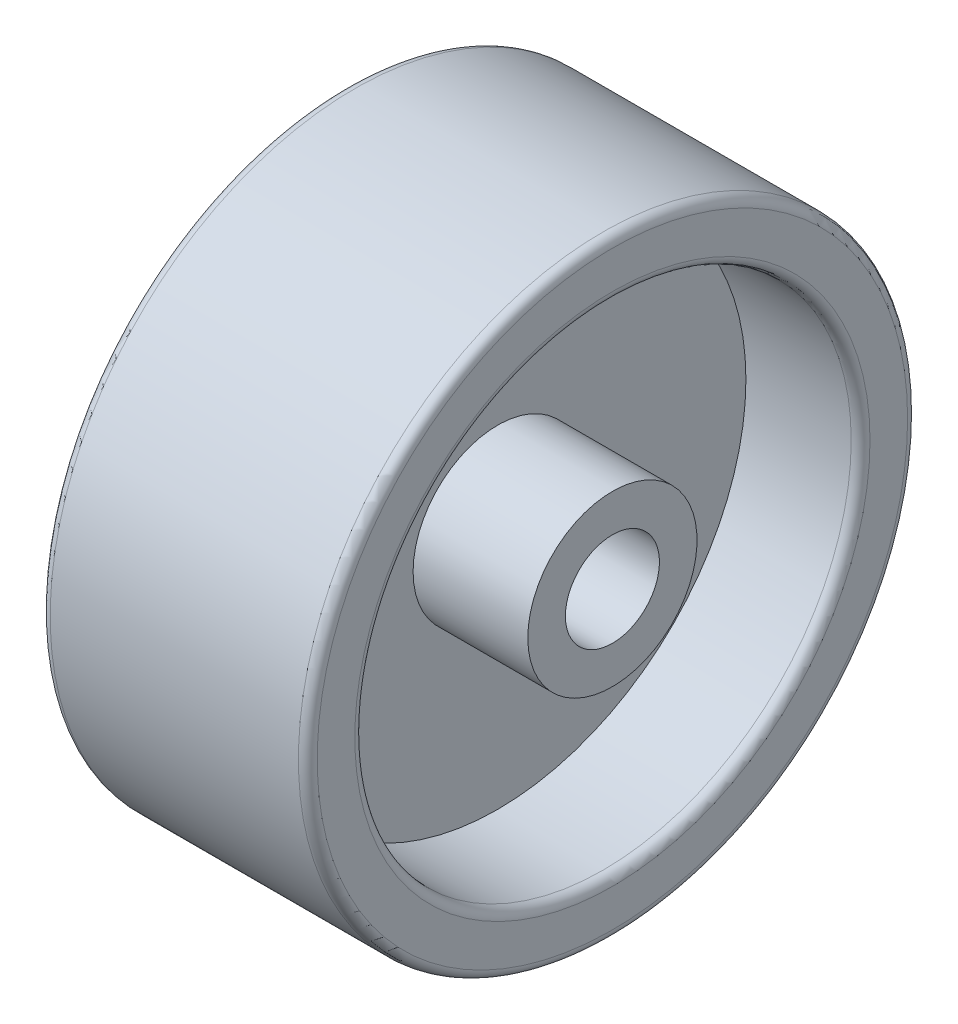
ISO-10303-21;
HEADER;
FILE_DESCRIPTION(('STEP AP214'),'2;1');
FILE_NAME('part.step','',(''),(''),'','','');
FILE_SCHEMA(('AUTOMOTIVE_DESIGN { 1 0 10303 214 1 1 1 1 }'));
ENDSEC;
DATA;
#1=APPLICATION_CONTEXT('core data for automotive mechanical design processes');
#2=APPLICATION_PROTOCOL_DEFINITION('international standard','automotive_design',2000,#1);
#3=PRODUCT_CONTEXT('',#1,'mechanical');
#4=PRODUCT('Part','Part','',(#3));
#5=PRODUCT_RELATED_PRODUCT_CATEGORY('part','',(#4));
#6=PRODUCT_DEFINITION_FORMATION('','',#4);
#7=PRODUCT_DEFINITION_CONTEXT('part definition',#1,'design');
#8=PRODUCT_DEFINITION('design','',#6,#7);
#9=PRODUCT_DEFINITION_SHAPE('','',#8);
#10=(LENGTH_UNIT() NAMED_UNIT(*) SI_UNIT(.MILLI.,.METRE.));
#11=(NAMED_UNIT(*) PLANE_ANGLE_UNIT() SI_UNIT($,.RADIAN.));
#12=(NAMED_UNIT(*) SI_UNIT($,.STERADIAN.) SOLID_ANGLE_UNIT());
#13=UNCERTAINTY_MEASURE_WITH_UNIT(LENGTH_MEASURE(1.E-05),#10,'distance_accuracy_value','');
#14=(GEOMETRIC_REPRESENTATION_CONTEXT(3) GLOBAL_UNCERTAINTY_ASSIGNED_CONTEXT((#13)) GLOBAL_UNIT_ASSIGNED_CONTEXT((#10,
#11,#12)) REPRESENTATION_CONTEXT('',''));
#15=CARTESIAN_POINT('',(0.,0.,0.));
#16=DIRECTION('',(0.,0.,1.));
#17=DIRECTION('',(1.,0.,0.));
#18=AXIS2_PLACEMENT_3D('',#15,#16,#17);
#19=CARTESIAN_POINT('',(7.1,0.,0.));
#20=DIRECTION('',(-1.,0.,0.));
#21=DIRECTION('',(0.,0.,1.));
#22=AXIS2_PLACEMENT_3D('',#19,#20,#21);
#23=CYLINDRICAL_SURFACE('',#22,16.2);
#24=CARTESIAN_POINT('',(6.6,0.,0.));
#25=DIRECTION('',(1.,0.,0.));
#26=DIRECTION('',(0.,0.,-1.));
#27=AXIS2_PLACEMENT_3D('',#24,#25,#26);
#28=CIRCLE('',#27,16.2);
#29=CARTESIAN_POINT('',(6.6,0.,-16.2));
#30=VERTEX_POINT('',#29);
#31=EDGE_CURVE('E10',#30,#30,#28,.F.);
#32=ORIENTED_EDGE('',*,*,#31,.T.);
#33=EDGE_LOOP('',(#32));
#34=FACE_BOUND('',#33,.T.);
#35=CARTESIAN_POINT('',(-6.6,0.,0.));
#36=DIRECTION('',(1.,0.,0.));
#37=DIRECTION('',(0.,0.,-1.));
#38=AXIS2_PLACEMENT_3D('',#35,#36,#37);
#39=CIRCLE('',#38,16.2);
#40=CARTESIAN_POINT('',(-6.6,0.,-16.2));
#41=VERTEX_POINT('',#40);
#42=EDGE_CURVE('E60',#41,#41,#39,.T.);
#43=ORIENTED_EDGE('',*,*,#42,.T.);
#44=EDGE_LOOP('',(#43));
#45=FACE_BOUND('',#44,.T.);
#46=ADVANCED_FACE('F31',(#34,#45),#23,.T.);
#47=CARTESIAN_POINT('',(7.1,0.,0.));
#48=DIRECTION('',(1.,0.,0.));
#49=DIRECTION('',(0.,0.,-1.));
#50=AXIS2_PLACEMENT_3D('',#47,#48,#49);
#51=PLANE('',#50);
#52=CARTESIAN_POINT('',(7.1,0.,0.));
#53=DIRECTION('',(1.,0.,0.));
#54=DIRECTION('',(0.,0.,-1.));
#55=AXIS2_PLACEMENT_3D('',#52,#53,#54);
#56=CIRCLE('',#55,15.7);
#57=CARTESIAN_POINT('',(7.1,0.,-15.7));
#58=VERTEX_POINT('',#57);
#59=EDGE_CURVE('E38',#58,#58,#56,.T.);
#60=ORIENTED_EDGE('',*,*,#59,.T.);
#61=EDGE_LOOP('',(#60));
#62=FACE_BOUND('',#61,.T.);
#63=CARTESIAN_POINT('',(7.1,0.,0.));
#64=DIRECTION('',(1.,0.,0.));
#65=DIRECTION('',(0.,0.,-1.));
#66=AXIS2_PLACEMENT_3D('',#63,#64,#65);
#67=CIRCLE('',#66,13.7);
#68=CARTESIAN_POINT('',(7.1,0.,-13.7));
#69=VERTEX_POINT('',#68);
#70=EDGE_CURVE('E46',#69,#69,#67,.F.);
#71=ORIENTED_EDGE('',*,*,#70,.T.);
#72=EDGE_LOOP('',(#71));
#73=FACE_BOUND('',#72,.T.);
#74=ADVANCED_FACE('F119',(#62,#73),#51,.T.);
#75=CARTESIAN_POINT('',(-7.1,0.,0.));
#76=DIRECTION('',(1.,0.,0.));
#77=DIRECTION('',(0.,0.,-1.));
#78=AXIS2_PLACEMENT_3D('',#75,#76,#77);
#79=PLANE('',#78);
#80=CARTESIAN_POINT('',(-7.1,0.,0.));
#81=DIRECTION('',(1.,0.,0.));
#82=DIRECTION('',(0.,0.,-1.));
#83=AXIS2_PLACEMENT_3D('',#80,#81,#82);
#84=CIRCLE('',#83,13.7);
#85=CARTESIAN_POINT('',(-7.1,0.,-13.7));
#86=VERTEX_POINT('',#85);
#87=EDGE_CURVE('E51',#86,#86,#84,.T.);
#88=ORIENTED_EDGE('',*,*,#87,.T.);
#89=EDGE_LOOP('',(#88));
#90=FACE_BOUND('',#89,.T.);
#91=CARTESIAN_POINT('',(-7.1,0.,0.));
#92=DIRECTION('',(1.,0.,0.));
#93=DIRECTION('',(0.,0.,-1.));
#94=AXIS2_PLACEMENT_3D('',#91,#92,#93);
#95=CIRCLE('',#94,15.7);
#96=CARTESIAN_POINT('',(-7.1,0.,-15.7));
#97=VERTEX_POINT('',#96);
#98=EDGE_CURVE('E57',#97,#97,#95,.F.);
#99=ORIENTED_EDGE('',*,*,#98,.T.);
#100=EDGE_LOOP('',(#99));
#101=FACE_BOUND('',#100,.T.);
#102=ADVANCED_FACE('F103',(#90,#101),#79,.F.);
#103=CARTESIAN_POINT('',(-1.,0.,0.));
#104=DIRECTION('',(-1.,0.,0.));
#105=DIRECTION('',(0.,0.,1.));
#106=AXIS2_PLACEMENT_3D('',#103,#104,#105);
#107=CYLINDRICAL_SURFACE('',#106,13.2);
#108=CARTESIAN_POINT('',(-6.6,0.,0.));
#109=DIRECTION('',(1.,0.,0.));
#110=DIRECTION('',(0.,0.,-1.));
#111=AXIS2_PLACEMENT_3D('',#108,#109,#110);
#112=CIRCLE('',#111,13.2);
#113=CARTESIAN_POINT('',(-6.6,0.,-13.2));
#114=VERTEX_POINT('',#113);
#115=EDGE_CURVE('E54',#114,#114,#112,.F.);
#116=ORIENTED_EDGE('',*,*,#115,.T.);
#117=EDGE_LOOP('',(#116));
#118=FACE_BOUND('',#117,.T.);
#119=CARTESIAN_POINT('',(-1.,0.,0.));
#120=DIRECTION('',(-1.,0.,0.));
#121=DIRECTION('',(0.,0.,1.));
#122=AXIS2_PLACEMENT_3D('',#119,#120,#121);
#123=CIRCLE('',#122,13.2);
#124=CARTESIAN_POINT('',(-1.,0.,13.2));
#125=VERTEX_POINT('',#124);
#126=EDGE_CURVE('E63',#125,#125,#123,.T.);
#127=ORIENTED_EDGE('',*,*,#126,.F.);
#128=EDGE_LOOP('',(#127));
#129=FACE_BOUND('',#128,.T.);
#130=ADVANCED_FACE('F114',(#118,#129),#107,.F.);
#131=CARTESIAN_POINT('',(-1.,0.,0.));
#132=DIRECTION('',(-1.,0.,0.));
#133=DIRECTION('',(0.,0.,1.));
#134=AXIS2_PLACEMENT_3D('',#131,#132,#133);
#135=PLANE('',#134);
#136=CARTESIAN_POINT('',(-1.,0.,0.));
#137=DIRECTION('',(-1.,0.,0.));
#138=DIRECTION('',(0.,0.,1.));
#139=AXIS2_PLACEMENT_3D('',#136,#137,#138);
#140=CIRCLE('',#139,4.5);
#141=CARTESIAN_POINT('',(-1.,0.,4.5));
#142=VERTEX_POINT('',#141);
#143=EDGE_CURVE('E66',#142,#142,#140,.T.);
#144=ORIENTED_EDGE('',*,*,#143,.F.);
#145=EDGE_LOOP('',(#144));
#146=FACE_BOUND('',#145,.T.);
#147=ORIENTED_EDGE('',*,*,#126,.T.);
#148=EDGE_LOOP('',(#147));
#149=FACE_BOUND('',#148,.T.);
#150=ADVANCED_FACE('F107',(#146,#149),#135,.T.);
#151=CARTESIAN_POINT('',(-1.,0.,0.));
#152=DIRECTION('',(-1.,0.,0.));
#153=DIRECTION('',(0.,0.,1.));
#154=AXIS2_PLACEMENT_3D('',#151,#152,#153);
#155=CYLINDRICAL_SURFACE('',#154,4.5);
#156=ORIENTED_EDGE('',*,*,#143,.T.);
#157=EDGE_LOOP('',(#156));
#158=FACE_BOUND('',#157,.T.);
#159=CARTESIAN_POINT('',(-7.1,0.,0.));
#160=DIRECTION('',(-1.,0.,0.));
#161=DIRECTION('',(0.,0.,1.));
#162=AXIS2_PLACEMENT_3D('',#159,#160,#161);
#163=CIRCLE('',#162,4.5);
#164=CARTESIAN_POINT('',(-7.1,0.,4.5));
#165=VERTEX_POINT('',#164);
#166=EDGE_CURVE('E67',#165,#165,#163,.T.);
#167=ORIENTED_EDGE('',*,*,#166,.F.);
#168=EDGE_LOOP('',(#167));
#169=FACE_BOUND('',#168,.T.);
#170=ADVANCED_FACE('F101',(#158,#169),#155,.T.);
#171=CARTESIAN_POINT('',(-7.1,0.,0.));
#172=DIRECTION('',(-1.,0.,0.));
#173=DIRECTION('',(0.,0.,1.));
#174=AXIS2_PLACEMENT_3D('',#171,#172,#173);
#175=CIRCLE('',#174,2.5);
#176=CARTESIAN_POINT('',(-7.1,0.,2.5));
#177=VERTEX_POINT('',#176);
#178=EDGE_CURVE('E82',#177,#177,#175,.T.);
#179=ORIENTED_EDGE('',*,*,#178,.F.);
#180=EDGE_LOOP('',(#179));
#181=FACE_BOUND('',#180,.T.);
#182=ORIENTED_EDGE('',*,*,#166,.T.);
#183=EDGE_LOOP('',(#182));
#184=FACE_BOUND('',#183,.T.);
#185=ADVANCED_FACE('F97',(#181,#184),#79,.F.);
#186=CARTESIAN_POINT('',(1.,0.,0.));
#187=DIRECTION('',(1.,0.,0.));
#188=DIRECTION('',(0.,0.,1.));
#189=AXIS2_PLACEMENT_3D('',#186,#187,#188);
#190=PLANE('',#189);
#191=CARTESIAN_POINT('',(1.,0.,0.));
#192=DIRECTION('',(-1.,0.,0.));
#193=DIRECTION('',(0.,0.,1.));
#194=AXIS2_PLACEMENT_3D('',#191,#192,#193);
#195=CIRCLE('',#194,13.2);
#196=CARTESIAN_POINT('',(1.,0.,13.2));
#197=VERTEX_POINT('',#196);
#198=EDGE_CURVE('E70',#197,#197,#195,.T.);
#199=ORIENTED_EDGE('',*,*,#198,.F.);
#200=EDGE_LOOP('',(#199));
#201=FACE_BOUND('',#200,.T.);
#202=CARTESIAN_POINT('',(1.,0.,0.));
#203=DIRECTION('',(-1.,0.,0.));
#204=DIRECTION('',(0.,0.,1.));
#205=AXIS2_PLACEMENT_3D('',#202,#203,#204);
#206=CIRCLE('',#205,4.5);
#207=CARTESIAN_POINT('',(1.,0.,4.5));
#208=VERTEX_POINT('',#207);
#209=EDGE_CURVE('E75',#208,#208,#206,.T.);
#210=ORIENTED_EDGE('',*,*,#209,.T.);
#211=EDGE_LOOP('',(#210));
#212=FACE_BOUND('',#211,.T.);
#213=ADVANCED_FACE('F100',(#201,#212),#190,.T.);
#214=CARTESIAN_POINT('',(1.,0.,0.));
#215=DIRECTION('',(1.,0.,0.));
#216=DIRECTION('',(0.,0.,-1.));
#217=AXIS2_PLACEMENT_3D('',#214,#215,#216);
#218=CYLINDRICAL_SURFACE('',#217,13.2);
#219=CARTESIAN_POINT('',(6.6,0.,0.));
#220=DIRECTION('',(1.,0.,0.));
#221=DIRECTION('',(0.,0.,-1.));
#222=AXIS2_PLACEMENT_3D('',#219,#220,#221);
#223=CIRCLE('',#222,13.2);
#224=CARTESIAN_POINT('',(6.6,0.,-13.2));
#225=VERTEX_POINT('',#224);
#226=EDGE_CURVE('E42',#225,#225,#223,.T.);
#227=ORIENTED_EDGE('',*,*,#226,.T.);
#228=EDGE_LOOP('',(#227));
#229=FACE_BOUND('',#228,.T.);
#230=ORIENTED_EDGE('',*,*,#198,.T.);
#231=EDGE_LOOP('',(#230));
#232=FACE_BOUND('',#231,.T.);
#233=ADVANCED_FACE('F146',(#229,#232),#218,.F.);
#234=CARTESIAN_POINT('',(1.,0.,0.));
#235=DIRECTION('',(1.,0.,0.));
#236=DIRECTION('',(0.,0.,-1.));
#237=AXIS2_PLACEMENT_3D('',#234,#235,#236);
#238=CYLINDRICAL_SURFACE('',#237,4.5);
#239=ORIENTED_EDGE('',*,*,#209,.F.);
#240=EDGE_LOOP('',(#239));
#241=FACE_BOUND('',#240,.T.);
#242=CARTESIAN_POINT('',(7.1,0.,0.));
#243=DIRECTION('',(-1.,0.,0.));
#244=DIRECTION('',(0.,0.,1.));
#245=AXIS2_PLACEMENT_3D('',#242,#243,#244);
#246=CIRCLE('',#245,4.5);
#247=CARTESIAN_POINT('',(7.1,0.,4.5));
#248=VERTEX_POINT('',#247);
#249=EDGE_CURVE('E76',#248,#248,#246,.T.);
#250=ORIENTED_EDGE('',*,*,#249,.T.);
#251=EDGE_LOOP('',(#250));
#252=FACE_BOUND('',#251,.T.);
#253=ADVANCED_FACE('F149',(#241,#252),#238,.T.);
#254=CARTESIAN_POINT('',(7.1,0.,0.));
#255=DIRECTION('',(-1.,0.,0.));
#256=DIRECTION('',(0.,0.,1.));
#257=AXIS2_PLACEMENT_3D('',#254,#255,#256);
#258=CIRCLE('',#257,2.5);
#259=CARTESIAN_POINT('',(7.1,0.,2.5));
#260=VERTEX_POINT('',#259);
#261=EDGE_CURVE('E79',#260,#260,#258,.T.);
#262=ORIENTED_EDGE('',*,*,#261,.T.);
#263=EDGE_LOOP('',(#262));
#264=FACE_BOUND('',#263,.T.);
#265=ORIENTED_EDGE('',*,*,#249,.F.);
#266=EDGE_LOOP('',(#265));
#267=FACE_BOUND('',#266,.T.);
#268=ADVANCED_FACE('F88',(#264,#267),#51,.T.);
#269=CARTESIAN_POINT('',(-6.6,0.,0.));
#270=DIRECTION('',(1.,0.,0.));
#271=DIRECTION('',(0.,0.,-1.));
#272=AXIS2_PLACEMENT_3D('',#269,#270,#271);
#273=TOROIDAL_SURFACE('',#272,15.7,0.5);
#274=ORIENTED_EDGE('',*,*,#98,.F.);
#275=EDGE_LOOP('',(#274));
#276=FACE_BOUND('',#275,.T.);
#277=ORIENTED_EDGE('',*,*,#42,.F.);
#278=EDGE_LOOP('',(#277));
#279=FACE_BOUND('',#278,.T.);
#280=ADVANCED_FACE('F127',(#276,#279),#273,.T.);
#281=CARTESIAN_POINT('',(-6.6,0.,0.));
#282=DIRECTION('',(1.,0.,0.));
#283=DIRECTION('',(0.,0.,-1.));
#284=AXIS2_PLACEMENT_3D('',#281,#282,#283);
#285=TOROIDAL_SURFACE('',#284,13.7,0.5);
#286=ORIENTED_EDGE('',*,*,#87,.F.);
#287=EDGE_LOOP('',(#286));
#288=FACE_BOUND('',#287,.T.);
#289=ORIENTED_EDGE('',*,*,#115,.F.);
#290=EDGE_LOOP('',(#289));
#291=FACE_BOUND('',#290,.T.);
#292=ADVANCED_FACE('F130',(#288,#291),#285,.T.);
#293=CARTESIAN_POINT('',(6.6,0.,0.));
#294=DIRECTION('',(1.,0.,0.));
#295=DIRECTION('',(0.,0.,-1.));
#296=AXIS2_PLACEMENT_3D('',#293,#294,#295);
#297=TOROIDAL_SURFACE('',#296,13.7,0.5);
#298=ORIENTED_EDGE('',*,*,#226,.F.);
#299=EDGE_LOOP('',(#298));
#300=FACE_BOUND('',#299,.T.);
#301=ORIENTED_EDGE('',*,*,#70,.F.);
#302=EDGE_LOOP('',(#301));
#303=FACE_BOUND('',#302,.T.);
#304=ADVANCED_FACE('F133',(#300,#303),#297,.T.);
#305=CARTESIAN_POINT('',(6.6,0.,0.));
#306=DIRECTION('',(1.,0.,0.));
#307=DIRECTION('',(0.,0.,-1.));
#308=AXIS2_PLACEMENT_3D('',#305,#306,#307);
#309=TOROIDAL_SURFACE('',#308,15.7,0.5);
#310=ORIENTED_EDGE('',*,*,#31,.F.);
#311=EDGE_LOOP('',(#310));
#312=FACE_BOUND('',#311,.T.);
#313=ORIENTED_EDGE('',*,*,#59,.F.);
#314=EDGE_LOOP('',(#313));
#315=FACE_BOUND('',#314,.T.);
#316=ADVANCED_FACE('F33',(#312,#315),#309,.T.);
#317=CARTESIAN_POINT('',(7.1,0.,0.));
#318=DIRECTION('',(-1.,0.,0.));
#319=DIRECTION('',(0.,0.,1.));
#320=AXIS2_PLACEMENT_3D('',#317,#318,#319);
#321=CYLINDRICAL_SURFACE('',#320,2.5);
#322=ORIENTED_EDGE('',*,*,#261,.F.);
#323=EDGE_LOOP('',(#322));
#324=FACE_BOUND('',#323,.T.);
#325=ORIENTED_EDGE('',*,*,#178,.T.);
#326=EDGE_LOOP('',(#325));
#327=FACE_BOUND('',#326,.T.);
#328=ADVANCED_FACE('F91',(#324,#327),#321,.F.);
#329=CLOSED_SHELL('',(#46,#74,#102,#130,#150,#170,#185,#213,#233,#253,#268,#280,#292,#304,#316,#328));
#330=MANIFOLD_SOLID_BREP('B2',#329);
#331=ADVANCED_BREP_SHAPE_REPRESENTATION('',(#18,#330),#14);
#332=SHAPE_DEFINITION_REPRESENTATION(#9,#331);
ENDSEC;
END-ISO-10303-21;
